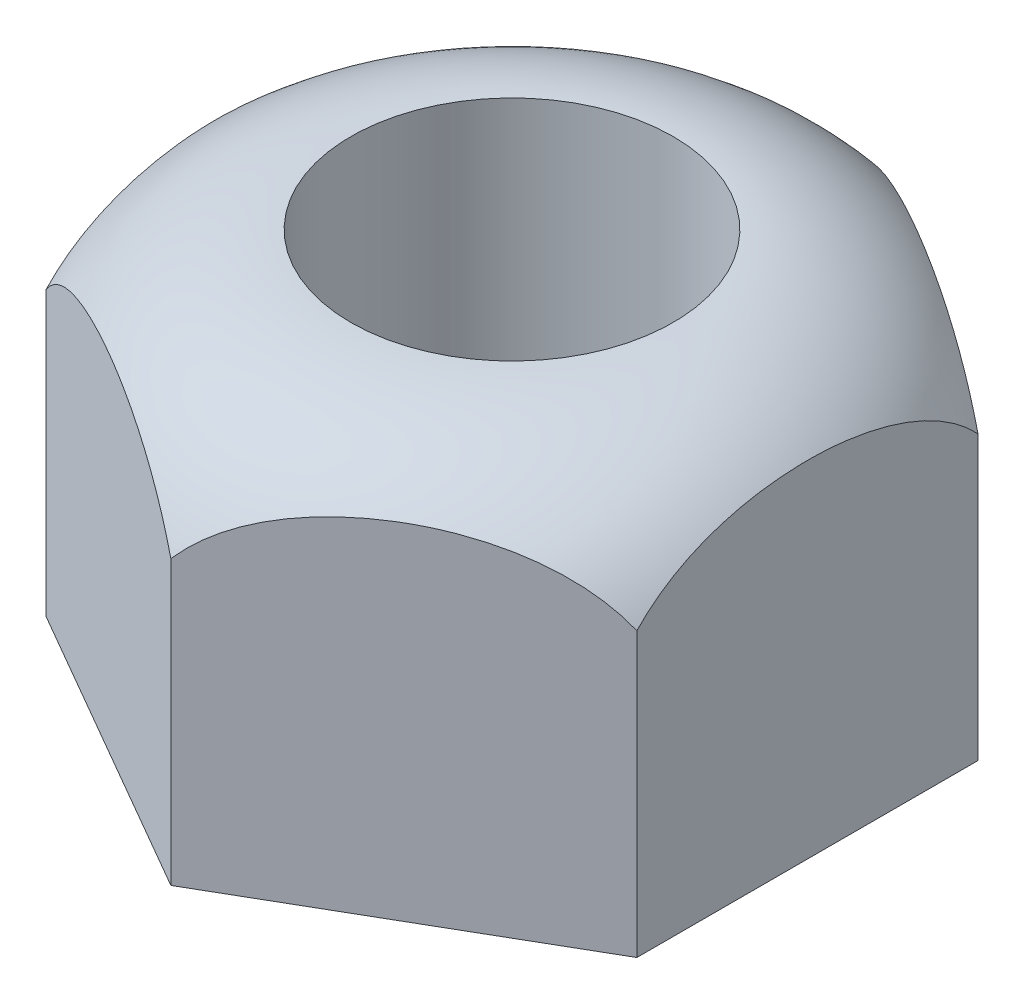
ISO-10303-21;
HEADER;
FILE_DESCRIPTION(('STEP AP214'),'2;1');
FILE_NAME('part.step','',(''),(''),'','','');
FILE_SCHEMA(('AUTOMOTIVE_DESIGN { 1 0 10303 214 1 1 1 1 }'));
ENDSEC;
DATA;
#1=APPLICATION_CONTEXT('core data for automotive mechanical design processes');
#2=APPLICATION_PROTOCOL_DEFINITION('international standard','automotive_design',2000,#1);
#3=PRODUCT_CONTEXT('',#1,'mechanical');
#4=PRODUCT('Part','Part','',(#3));
#5=PRODUCT_RELATED_PRODUCT_CATEGORY('part','',(#4));
#6=PRODUCT_DEFINITION_FORMATION('','',#4);
#7=PRODUCT_DEFINITION_CONTEXT('part definition',#1,'design');
#8=PRODUCT_DEFINITION('design','',#6,#7);
#9=PRODUCT_DEFINITION_SHAPE('','',#8);
#10=(LENGTH_UNIT() NAMED_UNIT(*) SI_UNIT(.MILLI.,.METRE.));
#11=(NAMED_UNIT(*) PLANE_ANGLE_UNIT() SI_UNIT($,.RADIAN.));
#12=(NAMED_UNIT(*) SI_UNIT($,.STERADIAN.) SOLID_ANGLE_UNIT());
#13=UNCERTAINTY_MEASURE_WITH_UNIT(LENGTH_MEASURE(1.E-05),#10,'distance_accuracy_value','');
#14=(GEOMETRIC_REPRESENTATION_CONTEXT(3) GLOBAL_UNCERTAINTY_ASSIGNED_CONTEXT((#13)) GLOBAL_UNIT_ASSIGNED_CONTEXT((#10,
#11,#12)) REPRESENTATION_CONTEXT('',''));
#15=CARTESIAN_POINT('',(0.,0.,0.));
#16=DIRECTION('',(0.,0.,1.));
#17=DIRECTION('',(1.,0.,0.));
#18=AXIS2_PLACEMENT_3D('',#15,#16,#17);
#19=CARTESIAN_POINT('',(0.,-1.85,0.));
#20=DIRECTION('',(0.,1.,0.));
#21=DIRECTION('',(0.,0.,1.));
#22=AXIS2_PLACEMENT_3D('',#19,#20,#21);
#23=PLANE('',#22);
#24=DIRECTION('',(0.,0.,-1.));
#25=VECTOR('',#24,1.);
#26=CARTESIAN_POINT('',(2.74999999999999,-1.85,1.58771324027148));
#27=LINE('',#26,#25);
#28=CARTESIAN_POINT('',(2.74999999999999,-1.85,1.58771324027148));
#29=VERTEX_POINT('',#28);
#30=CARTESIAN_POINT('',(2.74999999999999,-1.85,-1.58771324027148));
#31=VERTEX_POINT('',#30);
#32=EDGE_CURVE('E128',#29,#31,#27,.T.);
#33=ORIENTED_EDGE('',*,*,#32,.F.);
#34=DIRECTION('',(0.866025403784439,0.,-0.5));
#35=VECTOR('',#34,1.);
#36=CARTESIAN_POINT('',(0.,-1.85,3.17542648054294));
#37=LINE('',#36,#35);
#38=CARTESIAN_POINT('',(0.,-1.85,3.17542648054294));
#39=VERTEX_POINT('',#38);
#40=EDGE_CURVE('E117',#39,#29,#37,.T.);
#41=ORIENTED_EDGE('',*,*,#40,.F.);
#42=DIRECTION('',(0.866025403784439,0.,0.5));
#43=VECTOR('',#42,1.);
#44=CARTESIAN_POINT('',(-2.75,-1.85,1.58771324027148));
#45=LINE('',#44,#43);
#46=CARTESIAN_POINT('',(-2.75,-1.85,1.58771324027148));
#47=VERTEX_POINT('',#46);
#48=EDGE_CURVE('E119',#47,#39,#45,.T.);
#49=ORIENTED_EDGE('',*,*,#48,.F.);
#50=DIRECTION('',(0.,0.,1.));
#51=VECTOR('',#50,1.);
#52=CARTESIAN_POINT('',(-2.75,-1.85,-1.58771324027147));
#53=LINE('',#52,#51);
#54=CARTESIAN_POINT('',(-2.75,-1.85,-1.58771324027147));
#55=VERTEX_POINT('',#54);
#56=EDGE_CURVE('E122',#55,#47,#53,.T.);
#57=ORIENTED_EDGE('',*,*,#56,.F.);
#58=DIRECTION('',(-0.866025403784439,0.,0.499999999999999));
#59=VECTOR('',#58,1.);
#60=CARTESIAN_POINT('',(0.,-1.85,-3.17542648054294));
#61=LINE('',#60,#59);
#62=CARTESIAN_POINT('',(0.,-1.85,-3.17542648054294));
#63=VERTEX_POINT('',#62);
#64=EDGE_CURVE('E125',#63,#55,#61,.T.);
#65=ORIENTED_EDGE('',*,*,#64,.F.);
#66=DIRECTION('',(-0.866025403784439,0.,-0.5));
#67=VECTOR('',#66,1.);
#68=CARTESIAN_POINT('',(2.74999999999999,-1.85,-1.58771324027148));
#69=LINE('',#68,#67);
#70=EDGE_CURVE('E108',#31,#63,#69,.T.);
#71=ORIENTED_EDGE('',*,*,#70,.F.);
#72=EDGE_LOOP('',(#33,#41,#49,#57,#65,#71));
#73=FACE_BOUND('',#72,.T.);
#74=CARTESIAN_POINT('',(0.,-1.85,0.));
#75=DIRECTION('',(0.,1.,0.));
#76=DIRECTION('',(0.,0.,1.));
#77=AXIS2_PLACEMENT_3D('',#74,#75,#76);
#78=CIRCLE('',#77,1.5);
#79=CARTESIAN_POINT('',(0.,-1.85,1.5));
#80=VERTEX_POINT('',#79);
#81=EDGE_CURVE('E130',#80,#80,#78,.T.);
#82=ORIENTED_EDGE('',*,*,#81,.T.);
#83=EDGE_LOOP('',(#82));
#84=FACE_BOUND('',#83,.T.);
#85=ADVANCED_FACE('F35',(#73,#84),#23,.F.);
#86=CARTESIAN_POINT('',(2.74999999999999,1.85,1.58771324027148));
#87=DIRECTION('',(-1.,0.,0.));
#88=DIRECTION('',(0.,0.,1.));
#89=AXIS2_PLACEMENT_3D('',#86,#87,#88);
#90=PLANE('',#89);
#91=DIRECTION('',(0.,-1.,0.));
#92=VECTOR('',#91,1.);
#93=CARTESIAN_POINT('',(2.74999999999999,1.85,-1.58771324027148));
#94=LINE('',#93,#92);
#95=CARTESIAN_POINT('',(2.74999999999999,0.784503733767723,-1.58771324027148));
#96=VERTEX_POINT('',#95);
#97=EDGE_CURVE('E11',#96,#31,#94,.T.);
#98=ORIENTED_EDGE('',*,*,#97,.F.);
#99=CARTESIAN_POINT('',(2.74999999999999,1.36381816969859,0.));
#100=CARTESIAN_POINT('',(2.74999999999999,1.36382818072596,0.133534062266721));
#101=CARTESIAN_POINT('',(2.74999999999999,1.35499509623895,0.267174721183892));
#102=CARTESIAN_POINT('',(2.74999999999999,1.31853798944086,0.532125007988261));
#103=CARTESIAN_POINT('',(2.74999999999999,1.2908946616617,0.663432098662915));
#104=CARTESIAN_POINT('',(2.74999999999999,1.22367953044116,0.886902037983975));
#105=CARTESIAN_POINT('',(2.74999999999999,1.18895015876713,0.980505041940305));
#106=CARTESIAN_POINT('',(2.74999999999999,1.10587857775744,1.16145456962405));
#107=CARTESIAN_POINT('',(2.74999999999999,1.05756181555551,1.24881240963085));
#108=CARTESIAN_POINT('',(2.74999999999999,0.957712954077648,1.39643518970841));
#109=CARTESIAN_POINT('',(2.74999999999999,0.908940558488021,1.45855579026862));
#110=CARTESIAN_POINT('',(2.74999999999999,0.801940554934399,1.57409788989456));
#111=CARTESIAN_POINT('',(2.74999999999999,0.743722679428497,1.62752823096558));
#112=CARTESIAN_POINT('',(2.74999999999999,0.628921810210079,1.71491243205436));
#113=CARTESIAN_POINT('',(2.74999999999999,0.57368399483656,1.75062824251671));
#114=CARTESIAN_POINT('',(2.74999999999999,0.458013161508323,1.8123921063057));
#115=CARTESIAN_POINT('',(2.74999999999999,0.397582270670956,1.83844409496743));
#116=CARTESIAN_POINT('',(2.74999999999999,0.272723758697626,1.87953185920926));
#117=CARTESIAN_POINT('',(2.74999999999999,0.208278154071578,1.89451352450202));
#118=CARTESIAN_POINT('',(2.74999999999999,0.0777235331269642,1.91229377452443));
#119=CARTESIAN_POINT('',(2.74999999999999,0.0116150408133695,1.91509614996383));
#120=CARTESIAN_POINT('',(2.74999999999999,-0.114298409555004,1.90864041614302));
#121=CARTESIAN_POINT('',(2.74999999999999,-0.174158086755516,1.90039521759329));
#122=CARTESIAN_POINT('',(2.74999999999999,-0.291647051382623,1.87404483721453));
#123=CARTESIAN_POINT('',(2.74999999999999,-0.349276504054012,1.85594038739429));
#124=CARTESIAN_POINT('',(2.74999999999999,-0.461393902373208,1.81058480705631));
#125=CARTESIAN_POINT('',(2.74999999999999,-0.515848610256353,1.78325219831342));
#126=CARTESIAN_POINT('',(2.74999999999999,-0.620012157749186,1.7207237546055));
#127=CARTESIAN_POINT('',(2.74999999999999,-0.669719561610982,1.6855255514961));
#128=CARTESIAN_POINT('',(2.74999999999999,-0.769099180973125,1.60424256375215));
#129=CARTESIAN_POINT('',(2.74999999999999,-0.818129278808214,1.55737615398378));
#130=CARTESIAN_POINT('',(2.74999999999999,-0.909221870622027,1.45733929700995));
#131=CARTESIAN_POINT('',(2.74999999999999,-0.95128026525665,1.40416517218463));
#132=CARTESIAN_POINT('',(2.74999999999999,-1.05051582721268,1.2614063810128));
#133=CARTESIAN_POINT('',(2.74999999999999,-1.10267266224523,1.16832427543055));
#134=CARTESIAN_POINT('',(2.74999999999999,-1.19152742236651,0.975004393211526));
#135=CARTESIAN_POINT('',(2.74999999999999,-1.22818506867511,0.874748754326952));
#136=CARTESIAN_POINT('',(2.74999999999999,-1.27932672796015,0.699368826047305));
#137=CARTESIAN_POINT('',(2.74999999999999,-1.29715087252298,0.625181329776464));
#138=CARTESIAN_POINT('',(2.74999999999999,-1.32635527627525,0.475545749317214));
#139=CARTESIAN_POINT('',(2.74999999999999,-1.33773481923909,0.400097525975847));
#140=CARTESIAN_POINT('',(2.74999999999999,-1.35449162563369,0.248343399026151));
#141=CARTESIAN_POINT('',(2.74999999999999,-1.35985260493664,0.172035730068771));
#142=CARTESIAN_POINT('',(2.74999999999999,-1.36473206217348,0.0192525208399143));
#143=CARTESIAN_POINT('',(2.74999999999999,-1.36425146818913,-0.0572229908352457));
#144=CARTESIAN_POINT('',(2.74999999999999,-1.35732915119404,-0.212128444861984));
#145=CARTESIAN_POINT('',(2.74999999999999,-1.35071642606704,-0.29055135834772));
#146=CARTESIAN_POINT('',(2.74999999999999,-1.33102066253431,-0.446556482567467));
#147=CARTESIAN_POINT('',(2.74999999999999,-1.31793570679654,-0.524138437212114));
#148=CARTESIAN_POINT('',(2.74999999999999,-1.26831995736611,-0.754110358999802));
#149=CARTESIAN_POINT('',(2.74999999999999,-1.22139905331509,-0.904628284810319));
#150=CARTESIAN_POINT('',(2.74999999999999,-1.12254717771592,-1.12742278284898));
#151=CARTESIAN_POINT('',(2.74999999999999,-1.08203861548155,-1.20482747070819));
#152=CARTESIAN_POINT('',(2.74999999999999,-0.989779879242595,-1.35267915292954));
#153=CARTESIAN_POINT('',(2.74999999999999,-0.938044038149184,-1.42313485319041));
#154=CARTESIAN_POINT('',(2.74999999999999,-0.832518738219497,-1.54310808095762));
#155=CARTESIAN_POINT('',(2.74999999999999,-0.780484468098735,-1.59416129278473));
#156=CARTESIAN_POINT('',(2.74999999999999,-0.668670879407832,-1.68705145332225));
#157=CARTESIAN_POINT('',(2.74999999999999,-0.608893140783902,-1.72889027741004));
#158=CARTESIAN_POINT('',(2.74999999999999,-0.482152796067301,-1.8013362319719));
#159=CARTESIAN_POINT('',(2.74999999999999,-0.415135501179347,-1.83184884802661));
#160=CARTESIAN_POINT('',(2.74999999999999,-0.276384939722119,-1.87903015788431));
#161=CARTESIAN_POINT('',(2.74999999999999,-0.204656045307108,-1.89571149598497));
#162=CARTESIAN_POINT('',(2.74999999999999,-0.0695990441998225,-1.91268736380777));
#163=CARTESIAN_POINT('',(2.74999999999999,-0.00651455326068261,-1.91496284838844));
#164=CARTESIAN_POINT('',(2.74999999999999,0.119040473551698,-1.90826471657905));
#165=CARTESIAN_POINT('',(2.74999999999999,0.181511211954902,-1.8992949458532));
#166=CARTESIAN_POINT('',(2.74999999999999,0.300785846966703,-1.87138084642386));
#167=CARTESIAN_POINT('',(2.74999999999999,0.357716253053957,-1.85296875193519));
#168=CARTESIAN_POINT('',(2.74999999999999,0.467951293093743,-1.80742238943461));
#169=CARTESIAN_POINT('',(2.74999999999999,0.52125545622572,-1.7802869914238));
#170=CARTESIAN_POINT('',(2.74999999999999,0.626623754546816,-1.7164300627307));
#171=CARTESIAN_POINT('',(2.74999999999999,0.678374844839739,-1.67919476817579));
#172=CARTESIAN_POINT('',(2.74999999999999,0.775967630709042,-1.59769708059155));
#173=CARTESIAN_POINT('',(2.74999999999999,0.821806735652176,-1.55343162577513));
#174=CARTESIAN_POINT('',(2.74999999999999,0.927178802861812,-1.43747907599692));
#175=CARTESIAN_POINT('',(2.74999999999999,0.983203714128958,-1.36259521427988));
#176=CARTESIAN_POINT('',(2.74999999999999,1.082467227536,-1.2047284096066));
#177=CARTESIAN_POINT('',(2.74999999999999,1.1256708556347,-1.12172412000054));
#178=CARTESIAN_POINT('',(2.74999999999999,1.21608343058496,-0.914461139348996));
#179=CARTESIAN_POINT('',(2.74999999999999,1.2572664840885,-0.787594602219235));
#180=CARTESIAN_POINT('',(2.74999999999999,1.31927931312305,-0.529260892243063));
#181=CARTESIAN_POINT('',(2.74999999999999,1.34011506780425,-0.397795082684034));
#182=CARTESIAN_POINT('',(2.74999999999999,1.35593740675991,-0.221483672723944));
#183=CARTESIAN_POINT('',(2.74999999999999,1.35889830887946,-0.177233756365705));
#184=CARTESIAN_POINT('',(2.74999999999999,1.36283669239302,-0.0886597901310819));
#185=CARTESIAN_POINT('',(2.74999999999999,1.36381484585295,-0.0443357704726018));
#186=CARTESIAN_POINT('',(2.74999999999999,1.36381816969859,0.));
#187=B_SPLINE_CURVE_WITH_KNOTS('',3,(#99,#100,#101,#102,#103,#104,#105,#106,#107,#108,#109,#110,
#111,#112,#113,#114,#115,#116,#117,#118,#119,#120,#121,#122,#123,#124,#125,#126,#127,#128,#129,
#130,#131,#132,#133,#134,#135,#136,#137,#138,#139,#140,#141,#142,#143,#144,#145,#146,#147,#148,
#149,#150,#151,#152,#153,#154,#155,#156,#157,#158,#159,#160,#161,#162,#163,#164,#165,#166,#167,
#168,#169,#170,#171,#172,#173,#174,#175,#176,#177,#178,#179,#180,#181,#182,#183,#184,#185,#186),
.UNSPECIFIED.,.T.,.F.,(4,2,2,2,2,2,2,2,2,2,2,2,2,2,2,2,2,2,2,2,2,2,2,2,2,2,2,2,2,2,2,2,2,2,2,2,
2,2,2,2,2,2,2,4),(0.,0.400495831677242,0.801403324399677,1.10003068931887,1.3981024529205,
1.63416842251306,1.86999268083475,2.06650632229733,2.26293985071089,2.46032728180548,
2.65765327318714,2.83806997450557,3.01847328245324,3.20051299553746,3.38260759049258,
3.5853341855374,3.78817956369287,4.10648140805388,4.42560543480346,4.65421998414424,
4.88285993574987,5.11211702730469,5.34133769604509,5.57714911179834,5.81303042614388,
6.28211623503486,6.54344971417104,6.80445151338109,7.02228123679809,7.24006658491363,
7.45963048603504,7.67899344391252,7.86738759944231,8.05571734531208,8.2344387913227,
8.41318339787887,8.60370375299923,8.79430731255911,9.07330481504848,9.35305651850888,
9.7510551445691,10.1489367816228,10.281953875757,10.4149258753132),.UNSPECIFIED.);
#188=CARTESIAN_POINT('',(2.75,0.784503733767723,1.58771324027147));
#189=VERTEX_POINT('',#188);
#190=EDGE_CURVE('E93',#96,#189,#187,.T.);
#191=ORIENTED_EDGE('',*,*,#190,.T.);
#192=DIRECTION('',(0.,-1.,0.));
#193=VECTOR('',#192,1.);
#194=CARTESIAN_POINT('',(2.74999999999999,1.85,1.58771324027148));
#195=LINE('',#194,#193);
#196=EDGE_CURVE('E59',#189,#29,#195,.T.);
#197=ORIENTED_EDGE('',*,*,#196,.T.);
#198=ORIENTED_EDGE('',*,*,#32,.T.);
#199=EDGE_LOOP('',(#98,#191,#197,#198));
#200=FACE_BOUND('',#199,.T.);
#201=ADVANCED_FACE('F37',(#200),#90,.F.);
#202=CARTESIAN_POINT('',(2.74999999999999,1.85,-1.58771324027148));
#203=DIRECTION('',(-0.5,0.,0.866025403784439));
#204=DIRECTION('',(0.866025403784439,0.,0.5));
#205=AXIS2_PLACEMENT_3D('',#202,#203,#204);
#206=PLANE('',#205);
#207=DIRECTION('',(0.,-1.,0.));
#208=VECTOR('',#207,1.);
#209=CARTESIAN_POINT('',(0.,1.85,-3.17542648054294));
#210=LINE('',#209,#208);
#211=CARTESIAN_POINT('',(0.,0.784503733767723,-3.17542648054294));
#212=VERTEX_POINT('',#211);
#213=EDGE_CURVE('E44',#212,#63,#210,.T.);
#214=ORIENTED_EDGE('',*,*,#213,.F.);
#215=CARTESIAN_POINT('',(-0.000162171135401809,0.784303733767723,-3.17552011009162));
#216=CARTESIAN_POINT('',(0.0602337490128284,0.85876553522643,-3.14065050933609));
#217=CARTESIAN_POINT('',(0.127297974869581,0.924978428638823,-3.1019309604847));
#218=CARTESIAN_POINT('',(0.269985351734684,1.0411832163792,-3.01955036504167));
#219=CARTESIAN_POINT('',(0.345480081224079,1.09138293595417,-2.97596346264857));
#220=CARTESIAN_POINT('',(0.524187131977478,1.18998736462426,-2.87278689879001));
#221=CARTESIAN_POINT('',(0.629210399826241,1.2338902110026,-2.81215168682635));
#222=CARTESIAN_POINT('',(0.844525113800001,1.30230505545792,-2.68783967875312));
#223=CARTESIAN_POINT('',(0.954849222470463,1.32667422352381,-2.62414402491412));
#224=CARTESIAN_POINT('',(1.1369127582553,1.3523139674473,-2.51902959351913));
#225=CARTESIAN_POINT('',(1.20815709530822,1.35875351747551,-2.47789665634339));
#226=CARTESIAN_POINT('',(1.35090177445449,1.36482745136498,-2.3954829774129));
#227=CARTESIAN_POINT('',(1.42240220544993,1.36445918375194,-2.35420218433051));
#228=CARTESIAN_POINT('',(1.5650119149552,1.35690328649125,-2.27186643015859));
#229=CARTESIAN_POINT('',(1.63612165484462,1.34972739307274,-2.23081120269143));
#230=CARTESIAN_POINT('',(1.77749327017054,1.32824960829496,-2.14919026252723));
#231=CARTESIAN_POINT('',(1.84775561894996,1.31395190375692,-2.10862427654554));
#232=CARTESIAN_POINT('',(2.00585255036816,1.27265478579384,-2.01734697063319));
#233=CARTESIAN_POINT('',(2.09323427209155,1.24325023431585,-1.96689711007394));
#234=CARTESIAN_POINT('',(2.26315259921085,1.17036619344468,-1.86879471817136));
#235=CARTESIAN_POINT('',(2.34570983695629,1.12695275974114,-1.82113027473548));
#236=CARTESIAN_POINT('',(2.48423603739631,1.03668328378991,-1.74115213562162));
#237=CARTESIAN_POINT('',(2.54181943520654,0.993175326349363,-1.70790634539503));
#238=CARTESIAN_POINT('',(2.65110312529971,0.896270210092082,-1.6448113775017));
#239=CARTESIAN_POINT('',(2.70274890427551,0.842791674796964,-1.61499367310751));
#240=CARTESIAN_POINT('',(2.75016217113542,0.784303733767747,-1.58761961072279));
#241=B_SPLINE_CURVE_WITH_KNOTS('',3,(#215,#216,#217,#218,#219,#220,#221,#222,#223,#224,#225,
#226,#227,#228,#229,#230,#231,#232,#233,#234,#235,#236,#237,#238,#239,#240),.UNSPECIFIED.,.F.,
.F.,(4,2,2,2,2,2,2,2,2,2,2,2,4),(0.,0.304345279571459,0.604562723543205,0.989477249874162,
1.37718122870368,1.62448537709631,1.87188584628378,2.11886057494365,2.36569028139406,
2.68006439713608,2.99297729924679,3.23051774527102,3.47008927502126),.UNSPECIFIED.);
#242=EDGE_CURVE('E88',#212,#96,#241,.T.);
#243=ORIENTED_EDGE('',*,*,#242,.T.);
#244=ORIENTED_EDGE('',*,*,#97,.T.);
#245=ORIENTED_EDGE('',*,*,#70,.T.);
#246=EDGE_LOOP('',(#214,#243,#244,#245));
#247=FACE_BOUND('',#246,.T.);
#248=ADVANCED_FACE('F106',(#247),#206,.F.);
#249=CARTESIAN_POINT('',(0.,1.85,-3.17542648054294));
#250=DIRECTION('',(0.499999999999999,0.,0.866025403784439));
#251=DIRECTION('',(0.866025403784439,0.,-0.499999999999999));
#252=AXIS2_PLACEMENT_3D('',#249,#250,#251);
#253=PLANE('',#252);
#254=DIRECTION('',(0.,-1.,0.));
#255=VECTOR('',#254,1.);
#256=CARTESIAN_POINT('',(-2.75,1.85,-1.58771324027147));
#257=LINE('',#256,#255);
#258=CARTESIAN_POINT('',(-2.75,0.784503733767723,-1.58771324027146));
#259=VERTEX_POINT('',#258);
#260=EDGE_CURVE('E103',#259,#55,#257,.T.);
#261=ORIENTED_EDGE('',*,*,#260,.F.);
#262=CARTESIAN_POINT('',(-2.75016217113541,0.784303733767723,-1.58761961072279));
#263=CARTESIAN_POINT('',(-2.68976625098718,0.85876553522643,-1.62248921147833));
#264=CARTESIAN_POINT('',(-2.62270202513042,0.924978428638823,-1.66120876032972));
#265=CARTESIAN_POINT('',(-2.48001464826532,1.0411832163792,-1.74358935577274));
#266=CARTESIAN_POINT('',(-2.40451991877593,1.09138293595417,-1.78717625816584));
#267=CARTESIAN_POINT('',(-2.22581286802253,1.18998736462427,-1.8903528220244));
#268=CARTESIAN_POINT('',(-2.12078960017376,1.23389021100261,-1.95098803398806));
#269=CARTESIAN_POINT('',(-1.9054748862,1.30230505545793,-2.0753000420613));
#270=CARTESIAN_POINT('',(-1.79515077752954,1.32667422352382,-2.13899569590029));
#271=CARTESIAN_POINT('',(-1.6130872417447,1.35231396744731,-2.24411012729529));
#272=CARTESIAN_POINT('',(-1.54184290469179,1.35875351747551,-2.28524306447102));
#273=CARTESIAN_POINT('',(-1.39909822554551,1.36482745136498,-2.36765674340151));
#274=CARTESIAN_POINT('',(-1.32759779455007,1.36445918375195,-2.4089375364839));
#275=CARTESIAN_POINT('',(-1.18498808504481,1.35690328649125,-2.49127329065582));
#276=CARTESIAN_POINT('',(-1.11387834515539,1.34972739307274,-2.53232851812298));
#277=CARTESIAN_POINT('',(-0.972506729829459,1.32824960829497,-2.61394945828718));
#278=CARTESIAN_POINT('',(-0.902244381050039,1.31395190375693,-2.65451544426887));
#279=CARTESIAN_POINT('',(-0.744147449631841,1.27265478579384,-2.74579275018122));
#280=CARTESIAN_POINT('',(-0.656765727908448,1.24325023431586,-2.79624261074047));
#281=CARTESIAN_POINT('',(-0.486847400789145,1.17036619344468,-2.89434500264306));
#282=CARTESIAN_POINT('',(-0.404290163043706,1.12695275974114,-2.94200944607894));
#283=CARTESIAN_POINT('',(-0.265763962603687,1.03668328378992,-3.0219875851928));
#284=CARTESIAN_POINT('',(-0.208180564793457,0.993175326349368,-3.05523337541939));
#285=CARTESIAN_POINT('',(-0.0988968747002813,0.896270210092085,-3.11832834331272));
#286=CARTESIAN_POINT('',(-0.0472510957244762,0.842791674796965,-3.14814604770691));
#287=CARTESIAN_POINT('',(0.000162171135428989,0.784303733767748,-3.17552011009163));
#288=B_SPLINE_CURVE_WITH_KNOTS('',3,(#262,#263,#264,#265,#266,#267,#268,#269,#270,#271,#272,
#273,#274,#275,#276,#277,#278,#279,#280,#281,#282,#283,#284,#285,#286,#287),.UNSPECIFIED.,.F.,
.F.,(4,2,2,2,2,2,2,2,2,2,2,2,4),(0.,0.304345279571459,0.604562723543205,0.989477249874163,
1.37718122870368,1.62448537709631,1.87188584628379,2.11886057494365,2.36569028139407,
2.68006439713609,2.9929772992468,3.23051774527104,3.47008927502128),.UNSPECIFIED.);
#289=EDGE_CURVE('E91',#259,#212,#288,.T.);
#290=ORIENTED_EDGE('',*,*,#289,.T.);
#291=ORIENTED_EDGE('',*,*,#213,.T.);
#292=ORIENTED_EDGE('',*,*,#64,.T.);
#293=EDGE_LOOP('',(#261,#290,#291,#292));
#294=FACE_BOUND('',#293,.T.);
#295=ADVANCED_FACE('F100',(#294),#253,.F.);
#296=CARTESIAN_POINT('',(-2.75,1.85,-1.58771324027147));
#297=DIRECTION('',(1.,0.,0.));
#298=DIRECTION('',(0.,0.,-1.));
#299=AXIS2_PLACEMENT_3D('',#296,#297,#298);
#300=PLANE('',#299);
#301=DIRECTION('',(0.,-1.,0.));
#302=VECTOR('',#301,1.);
#303=CARTESIAN_POINT('',(-2.75,1.85,1.58771324027148));
#304=LINE('',#303,#302);
#305=CARTESIAN_POINT('',(-2.74999999999999,0.784503733767723,1.58771324027148));
#306=VERTEX_POINT('',#305);
#307=EDGE_CURVE('E110',#306,#47,#304,.T.);
#308=ORIENTED_EDGE('',*,*,#307,.F.);
#309=CARTESIAN_POINT('',(-2.75,1.36381816969858,0.));
#310=CARTESIAN_POINT('',(-2.75,1.36382818072595,-0.13353406226672));
#311=CARTESIAN_POINT('',(-2.75,1.35499509623894,-0.267174721183892));
#312=CARTESIAN_POINT('',(-2.75,1.31853798944085,-0.532125007988263));
#313=CARTESIAN_POINT('',(-2.75,1.29089466166168,-0.663432098662918));
#314=CARTESIAN_POINT('',(-2.75,1.22367953044114,-0.886902037983977));
#315=CARTESIAN_POINT('',(-2.75,1.18895015876712,-0.980505041940306));
#316=CARTESIAN_POINT('',(-2.75,1.10587857775743,-1.16145456962404));
#317=CARTESIAN_POINT('',(-2.75,1.0575618155555,-1.24881240963085));
#318=CARTESIAN_POINT('',(-2.75,0.957712954077636,-1.39643518970841));
#319=CARTESIAN_POINT('',(-2.75,0.90894055848801,-1.45855579026862));
#320=CARTESIAN_POINT('',(-2.75,0.801940554934388,-1.57409788989456));
#321=CARTESIAN_POINT('',(-2.75,0.743722679428486,-1.62752823096557));
#322=CARTESIAN_POINT('',(-2.75,0.628921810210069,-1.71491243205435));
#323=CARTESIAN_POINT('',(-2.75,0.57368399483655,-1.7506282425167));
#324=CARTESIAN_POINT('',(-2.75,0.458013161508314,-1.81239210630569));
#325=CARTESIAN_POINT('',(-2.75,0.397582270670947,-1.83844409496742));
#326=CARTESIAN_POINT('',(-2.75,0.272723758697617,-1.87953185920925));
#327=CARTESIAN_POINT('',(-2.75,0.208278154071569,-1.89451352450201));
#328=CARTESIAN_POINT('',(-2.75,0.077723533126957,-1.91229377452441));
#329=CARTESIAN_POINT('',(-2.75,0.0116150408133628,-1.91509614996382));
#330=CARTESIAN_POINT('',(-2.75,-0.114298409555009,-1.908640416143));
#331=CARTESIAN_POINT('',(-2.75,-0.17415808675552,-1.90039521759328));
#332=CARTESIAN_POINT('',(-2.75,-0.291647051382626,-1.87404483721452));
#333=CARTESIAN_POINT('',(-2.75,-0.349276504054015,-1.85594038739427));
#334=CARTESIAN_POINT('',(-2.75,-0.46139390237321,-1.8105848070563));
#335=CARTESIAN_POINT('',(-2.75,-0.515848610256354,-1.78325219831341));
#336=CARTESIAN_POINT('',(-2.75,-0.620012157749187,-1.72072375460549));
#337=CARTESIAN_POINT('',(-2.75,-0.669719561610981,-1.68552555149608));
#338=CARTESIAN_POINT('',(-2.75,-0.769099180973124,-1.60424256375213));
#339=CARTESIAN_POINT('',(-2.75,-0.818129278808212,-1.55737615398376));
#340=CARTESIAN_POINT('',(-2.75,-0.909221870622024,-1.45733929700994));
#341=CARTESIAN_POINT('',(-2.75,-0.951280265256647,-1.40416517218462));
#342=CARTESIAN_POINT('',(-2.75,-1.05051582721267,-1.26140638101279));
#343=CARTESIAN_POINT('',(-2.75,-1.10267266224523,-1.16832427543053));
#344=CARTESIAN_POINT('',(-2.75,-1.1915274223665,-0.975004393211509));
#345=CARTESIAN_POINT('',(-2.75,-1.22818506867511,-0.874748754326935));
#346=CARTESIAN_POINT('',(-2.75,-1.27932672796014,-0.699368826047288));
#347=CARTESIAN_POINT('',(-2.75,-1.29715087252297,-0.625181329776448));
#348=CARTESIAN_POINT('',(-2.75,-1.32635527627524,-0.475545749317198));
#349=CARTESIAN_POINT('',(-2.75,-1.33773481923909,-0.400097525975832));
#350=CARTESIAN_POINT('',(-2.75,-1.35449162563369,-0.248343399026137));
#351=CARTESIAN_POINT('',(-2.75,-1.35985260493663,-0.172035730068757));
#352=CARTESIAN_POINT('',(-2.75,-1.36473206217347,-0.0192525208399009));
#353=CARTESIAN_POINT('',(-2.75,-1.36425146818912,0.0572229908352584));
#354=CARTESIAN_POINT('',(-2.75,-1.35732915119403,0.212128444861996));
#355=CARTESIAN_POINT('',(-2.75,-1.35071642606703,0.290551358347731));
#356=CARTESIAN_POINT('',(-2.75,-1.3310206625343,0.446556482567477));
#357=CARTESIAN_POINT('',(-2.75,-1.31793570679653,0.524138437212123));
#358=CARTESIAN_POINT('',(-2.75,-1.2683199573661,0.75411035899981));
#359=CARTESIAN_POINT('',(-2.75,-1.22139905331508,0.904628284810325));
#360=CARTESIAN_POINT('',(-2.75,-1.12254717771591,1.12742278284899));
#361=CARTESIAN_POINT('',(-2.75,-1.08203861548154,1.20482747070819));
#362=CARTESIAN_POINT('',(-2.75,-0.98977987924258,1.35267915292954));
#363=CARTESIAN_POINT('',(-2.75,-0.938044038149169,1.42313485319041));
#364=CARTESIAN_POINT('',(-2.75,-0.832518738219482,1.54310808095762));
#365=CARTESIAN_POINT('',(-2.75,-0.78048446809872,1.59416129278473));
#366=CARTESIAN_POINT('',(-2.75,-0.668670879407818,1.68705145332224));
#367=CARTESIAN_POINT('',(-2.75,-0.608893140783889,1.72889027741003));
#368=CARTESIAN_POINT('',(-2.75,-0.48215279606729,1.80133623197189));
#369=CARTESIAN_POINT('',(-2.75,-0.415135501179336,1.8318488480266));
#370=CARTESIAN_POINT('',(-2.75,-0.27638493972211,1.8790301578843));
#371=CARTESIAN_POINT('',(-2.75,-0.2046560453071,1.89571149598496));
#372=CARTESIAN_POINT('',(-2.75,-0.0695990441998155,1.91268736380776));
#373=CARTESIAN_POINT('',(-2.75,-0.00651455326067611,1.91496284838843));
#374=CARTESIAN_POINT('',(-2.75,0.119040473551704,1.90826471657903));
#375=CARTESIAN_POINT('',(-2.75,0.181511211954907,1.89929494585318));
#376=CARTESIAN_POINT('',(-2.75,0.300785846966706,1.87138084642384));
#377=CARTESIAN_POINT('',(-2.75,0.35771625305396,1.85296875193518));
#378=CARTESIAN_POINT('',(-2.75,0.467951293093745,1.80742238943459));
#379=CARTESIAN_POINT('',(-2.75,0.521255456225722,1.78028699142379));
#380=CARTESIAN_POINT('',(-2.75,0.626623754546817,1.71643006273069));
#381=CARTESIAN_POINT('',(-2.75,0.67837484483974,1.67919476817577));
#382=CARTESIAN_POINT('',(-2.75,0.775967630709042,1.59769708059153));
#383=CARTESIAN_POINT('',(-2.75,0.821806735652175,1.55343162577511));
#384=CARTESIAN_POINT('',(-2.75,0.92717880286181,1.4374790759969));
#385=CARTESIAN_POINT('',(-2.75,0.983203714128955,1.36259521427986));
#386=CARTESIAN_POINT('',(-2.75,1.082467227536,1.20472840960658));
#387=CARTESIAN_POINT('',(-2.75,1.1256708556347,1.12172412000052));
#388=CARTESIAN_POINT('',(-2.75,1.21608343058496,0.91446113934898));
#389=CARTESIAN_POINT('',(-2.75,1.2572664840885,0.787594602219219));
#390=CARTESIAN_POINT('',(-2.75,1.31927931312304,0.529260892243047));
#391=CARTESIAN_POINT('',(-2.75,1.34011506780424,0.397795082684017));
#392=CARTESIAN_POINT('',(-2.75,1.3559374067599,0.221483672723931));
#393=CARTESIAN_POINT('',(-2.75,1.35889830887945,0.177233756365695));
#394=CARTESIAN_POINT('',(-2.75,1.36283669239301,0.0886597901310781));
#395=CARTESIAN_POINT('',(-2.75,1.36381484585294,0.0443357704726007));
#396=CARTESIAN_POINT('',(-2.75,1.36381816969858,0.));
#397=B_SPLINE_CURVE_WITH_KNOTS('',3,(#309,#310,#311,#312,#313,#314,#315,#316,#317,#318,#319,
#320,#321,#322,#323,#324,#325,#326,#327,#328,#329,#330,#331,#332,#333,#334,#335,#336,#337,#338,
#339,#340,#341,#342,#343,#344,#345,#346,#347,#348,#349,#350,#351,#352,#353,#354,#355,#356,#357,
#358,#359,#360,#361,#362,#363,#364,#365,#366,#367,#368,#369,#370,#371,#372,#373,#374,#375,#376,
#377,#378,#379,#380,#381,#382,#383,#384,#385,#386,#387,#388,#389,#390,#391,#392,#393,#394,#395,
#396),.UNSPECIFIED.,.T.,.F.,(4,2,2,2,2,2,2,2,2,2,2,2,2,2,2,2,2,2,2,2,2,2,2,2,2,2,2,2,2,2,2,2,2,
2,2,2,2,2,2,2,2,2,2,4),(0.,0.400495831677244,0.801403324399683,1.10003068931887,1.3981024529205,
1.63416842251305,1.86999268083474,2.06650632229732,2.26293985071088,2.46032728180547,
2.65765327318713,2.83806997450556,3.01847328245322,3.20051299553744,3.38260759049256,
3.58533418553738,3.78817956369285,4.10648140805386,4.42560543480344,4.65421998414422,
4.88285993574985,5.11211702730467,5.34133769604506,5.57714911179832,5.81303042614385,
6.28211623503483,6.543449714171,6.80445151338106,7.02228123679805,7.24006658491359,
7.459630486035,7.67899344391248,7.86738759944226,8.05571734531203,8.23443879132265,
8.41318339787882,8.60370375299917,8.79430731255906,9.07330481504842,9.35305651850883,
9.75105514456905,10.1489367816227,10.2819538757569,10.4149258753131),.UNSPECIFIED.);
#398=EDGE_CURVE('E104',#306,#259,#397,.T.);
#399=ORIENTED_EDGE('',*,*,#398,.T.);
#400=ORIENTED_EDGE('',*,*,#260,.T.);
#401=ORIENTED_EDGE('',*,*,#56,.T.);
#402=EDGE_LOOP('',(#308,#399,#400,#401));
#403=FACE_BOUND('',#402,.T.);
#404=ADVANCED_FACE('F178',(#403),#300,.F.);
#405=CARTESIAN_POINT('',(-2.75,1.85,1.58771324027148));
#406=DIRECTION('',(0.5,0.,-0.866025403784439));
#407=DIRECTION('',(-0.866025403784439,0.,-0.5));
#408=AXIS2_PLACEMENT_3D('',#405,#406,#407);
#409=PLANE('',#408);
#410=DIRECTION('',(0.,-1.,0.));
#411=VECTOR('',#410,1.);
#412=CARTESIAN_POINT('',(0.,1.85,3.17542648054294));
#413=LINE('',#412,#411);
#414=CARTESIAN_POINT('',(0.,0.784503733767723,3.17542648054294));
#415=VERTEX_POINT('',#414);
#416=EDGE_CURVE('E114',#415,#39,#413,.T.);
#417=ORIENTED_EDGE('',*,*,#416,.F.);
#418=CARTESIAN_POINT('',(0.000162171135399757,0.784303733767723,3.17552011009162));
#419=CARTESIAN_POINT('',(-0.0602337490128304,0.85876553522643,3.14065050933609));
#420=CARTESIAN_POINT('',(-0.127297974869583,0.924978428638823,3.1019309604847));
#421=CARTESIAN_POINT('',(-0.269985351734686,1.0411832163792,3.01955036504167));
#422=CARTESIAN_POINT('',(-0.345480081224082,1.09138293595417,2.97596346264857));
#423=CARTESIAN_POINT('',(-0.524187131977481,1.18998736462426,2.87278689879001));
#424=CARTESIAN_POINT('',(-0.629210399826244,1.2338902110026,2.81215168682635));
#425=CARTESIAN_POINT('',(-0.844525113800004,1.30230505545792,2.68783967875312));
#426=CARTESIAN_POINT('',(-0.954849222470466,1.32667422352381,2.62414402491412));
#427=CARTESIAN_POINT('',(-1.1369127582553,1.3523139674473,2.51902959351913));
#428=CARTESIAN_POINT('',(-1.20815709530822,1.3587535174755,2.47789665634339));
#429=CARTESIAN_POINT('',(-1.35090177445449,1.36482745136498,2.3954829774129));
#430=CARTESIAN_POINT('',(-1.42240220544993,1.36445918375194,2.35420218433051));
#431=CARTESIAN_POINT('',(-1.5650119149552,1.35690328649125,2.27186643015859));
#432=CARTESIAN_POINT('',(-1.63612165484462,1.34972739307274,2.23081120269143));
#433=CARTESIAN_POINT('',(-1.77749327017054,1.32824960829496,2.14919026252724));
#434=CARTESIAN_POINT('',(-1.84775561894996,1.31395190375692,2.10862427654554));
#435=CARTESIAN_POINT('',(-2.00585255036816,1.27265478579383,2.01734697063319));
#436=CARTESIAN_POINT('',(-2.09323427209155,1.24325023431585,1.96689711007394));
#437=CARTESIAN_POINT('',(-2.26315259921085,1.17036619344468,1.86879471817136));
#438=CARTESIAN_POINT('',(-2.34570983695629,1.12695275974114,1.82113027473548));
#439=CARTESIAN_POINT('',(-2.48423603739631,1.03668328378991,1.74115213562162));
#440=CARTESIAN_POINT('',(-2.54181943520654,0.993175326349361,1.70790634539503));
#441=CARTESIAN_POINT('',(-2.65110312529971,0.896270210092081,1.6448113775017));
#442=CARTESIAN_POINT('',(-2.70274890427551,0.842791674796963,1.61499367310752));
#443=CARTESIAN_POINT('',(-2.75016217113541,0.784303733767747,1.58761961072279));
#444=B_SPLINE_CURVE_WITH_KNOTS('',3,(#418,#419,#420,#421,#422,#423,#424,#425,#426,#427,#428,
#429,#430,#431,#432,#433,#434,#435,#436,#437,#438,#439,#440,#441,#442,#443),.UNSPECIFIED.,.F.,
.F.,(4,2,2,2,2,2,2,2,2,2,2,2,4),(0.,0.304345279571459,0.604562723543205,0.989477249874163,
1.37718122870368,1.62448537709631,1.87188584628378,2.11886057494365,2.36569028139406,
2.68006439713608,2.99297729924679,3.23051774527102,3.47008927502125),.UNSPECIFIED.);
#445=EDGE_CURVE('E51',#415,#306,#444,.T.);
#446=ORIENTED_EDGE('',*,*,#445,.T.);
#447=ORIENTED_EDGE('',*,*,#307,.T.);
#448=ORIENTED_EDGE('',*,*,#48,.T.);
#449=EDGE_LOOP('',(#417,#446,#447,#448));
#450=FACE_BOUND('',#449,.T.);
#451=ADVANCED_FACE('F194',(#450),#409,.F.);
#452=CARTESIAN_POINT('',(0.,1.85,3.17542648054294));
#453=DIRECTION('',(-0.5,0.,-0.866025403784439));
#454=DIRECTION('',(-0.866025403784439,0.,0.5));
#455=AXIS2_PLACEMENT_3D('',#452,#453,#454);
#456=PLANE('',#455);
#457=ORIENTED_EDGE('',*,*,#196,.F.);
#458=CARTESIAN_POINT('',(2.75016217113541,0.784303733767723,1.58761961072279));
#459=CARTESIAN_POINT('',(2.68976625098718,0.85876553522643,1.62248921147833));
#460=CARTESIAN_POINT('',(2.62270202513042,0.924978428638823,1.66120876032972));
#461=CARTESIAN_POINT('',(2.48001464826532,1.0411832163792,1.74358935577275));
#462=CARTESIAN_POINT('',(2.40451991877593,1.09138293595417,1.78717625816585));
#463=CARTESIAN_POINT('',(2.22581286802253,1.18998736462427,1.89035282202441));
#464=CARTESIAN_POINT('',(2.12078960017376,1.2338902110026,1.95098803398806));
#465=CARTESIAN_POINT('',(1.9054748862,1.30230505545792,2.0753000420613));
#466=CARTESIAN_POINT('',(1.79515077752954,1.32667422352381,2.1389956959003));
#467=CARTESIAN_POINT('',(1.6130872417447,1.35231396744731,2.24411012729529));
#468=CARTESIAN_POINT('',(1.54184290469179,1.35875351747551,2.28524306447103));
#469=CARTESIAN_POINT('',(1.39909822554551,1.36482745136498,2.36765674340151));
#470=CARTESIAN_POINT('',(1.32759779455007,1.36445918375194,2.40893753648391));
#471=CARTESIAN_POINT('',(1.18498808504481,1.35690328649125,2.49127329065582));
#472=CARTESIAN_POINT('',(1.11387834515539,1.34972739307274,2.53232851812298));
#473=CARTESIAN_POINT('',(0.972506729829462,1.32824960829496,2.61394945828718));
#474=CARTESIAN_POINT('',(0.902244381050042,1.31395190375693,2.65451544426887));
#475=CARTESIAN_POINT('',(0.744147449631845,1.27265478579384,2.74579275018122));
#476=CARTESIAN_POINT('',(0.656765727908453,1.24325023431586,2.79624261074048));
#477=CARTESIAN_POINT('',(0.48684740078915,1.17036619344468,2.89434500264306));
#478=CARTESIAN_POINT('',(0.404290163043711,1.12695275974114,2.94200944607894));
#479=CARTESIAN_POINT('',(0.265763962603692,1.03668328378991,3.0219875851928));
#480=CARTESIAN_POINT('',(0.208180564793463,0.993175326349365,3.05523337541939));
#481=CARTESIAN_POINT('',(0.0988968747002888,0.896270210092083,3.11832834331272));
#482=CARTESIAN_POINT('',(0.0472510957244845,0.842791674796964,3.14814604770691));
#483=CARTESIAN_POINT('',(-0.000162171135419894,0.784303733767747,3.17552011009163));
#484=B_SPLINE_CURVE_WITH_KNOTS('',3,(#458,#459,#460,#461,#462,#463,#464,#465,#466,#467,#468,
#469,#470,#471,#472,#473,#474,#475,#476,#477,#478,#479,#480,#481,#482,#483),.UNSPECIFIED.,.F.,
.F.,(4,2,2,2,2,2,2,2,2,2,2,2,4),(0.,0.304345279571459,0.604562723543205,0.989477249874163,
1.37718122870368,1.62448537709631,1.87188584628378,2.11886057494365,2.36569028139406,
2.68006439713608,2.9929772992468,3.23051774527103,3.47008927502127),.UNSPECIFIED.);
#485=EDGE_CURVE('E150',#189,#415,#484,.T.);
#486=ORIENTED_EDGE('',*,*,#485,.T.);
#487=ORIENTED_EDGE('',*,*,#416,.T.);
#488=ORIENTED_EDGE('',*,*,#40,.T.);
#489=EDGE_LOOP('',(#457,#486,#487,#488));
#490=FACE_BOUND('',#489,.T.);
#491=ADVANCED_FACE('F191',(#490),#456,.F.);
#492=CARTESIAN_POINT('',(0.,1.85,0.));
#493=DIRECTION('',(0.,-1.,0.));
#494=DIRECTION('',(0.,0.,-1.));
#495=AXIS2_PLACEMENT_3D('',#492,#493,#494);
#496=CYLINDRICAL_SURFACE('',#495,1.5);
#497=CARTESIAN_POINT('',(0.,1.85,0.));
#498=DIRECTION('',(0.,-1.,0.));
#499=DIRECTION('',(0.,0.,-1.));
#500=AXIS2_PLACEMENT_3D('',#497,#498,#499);
#501=CIRCLE('',#500,1.5);
#502=CARTESIAN_POINT('',(0.,1.85,-1.5));
#503=VERTEX_POINT('',#502);
#504=EDGE_CURVE('E207',#503,#503,#501,.T.);
#505=ORIENTED_EDGE('',*,*,#504,.F.);
#506=EDGE_LOOP('',(#505));
#507=FACE_BOUND('',#506,.T.);
#508=ORIENTED_EDGE('',*,*,#81,.F.);
#509=EDGE_LOOP('',(#508));
#510=FACE_BOUND('',#509,.T.);
#511=ADVANCED_FACE('F144',(#507,#510),#496,.F.);
#512=CARTESIAN_POINT('',(0.,0.,0.));
#513=DIRECTION('',(0.,-1.,0.));
#514=DIRECTION('',(0.,0.,-1.));
#515=AXIS2_PLACEMENT_3D('',#512,#513,#514);
#516=DEGENERATE_TOROIDAL_SURFACE('',#515,1.5,1.85,.T.);
#517=ORIENTED_EDGE('',*,*,#504,.T.);
#518=EDGE_LOOP('',(#517));
#519=FACE_BOUND('',#518,.T.);
#520=ORIENTED_EDGE('',*,*,#242,.F.);
#521=ORIENTED_EDGE('',*,*,#289,.F.);
#522=ORIENTED_EDGE('',*,*,#398,.F.);
#523=ORIENTED_EDGE('',*,*,#445,.F.);
#524=ORIENTED_EDGE('',*,*,#485,.F.);
#525=ORIENTED_EDGE('',*,*,#190,.F.);
#526=EDGE_LOOP('',(#520,#521,#522,#523,#524,#525));
#527=FACE_BOUND('',#526,.T.);
#528=ADVANCED_FACE('F90',(#519,#527),#516,.T.);
#529=CLOSED_SHELL('',(#85,#201,#248,#295,#404,#451,#491,#511,#528));
#530=MANIFOLD_SOLID_BREP('B2',#529);
#531=ADVANCED_BREP_SHAPE_REPRESENTATION('',(#18,#530),#14);
#532=SHAPE_DEFINITION_REPRESENTATION(#9,#531);
ENDSEC;
END-ISO-10303-21;
